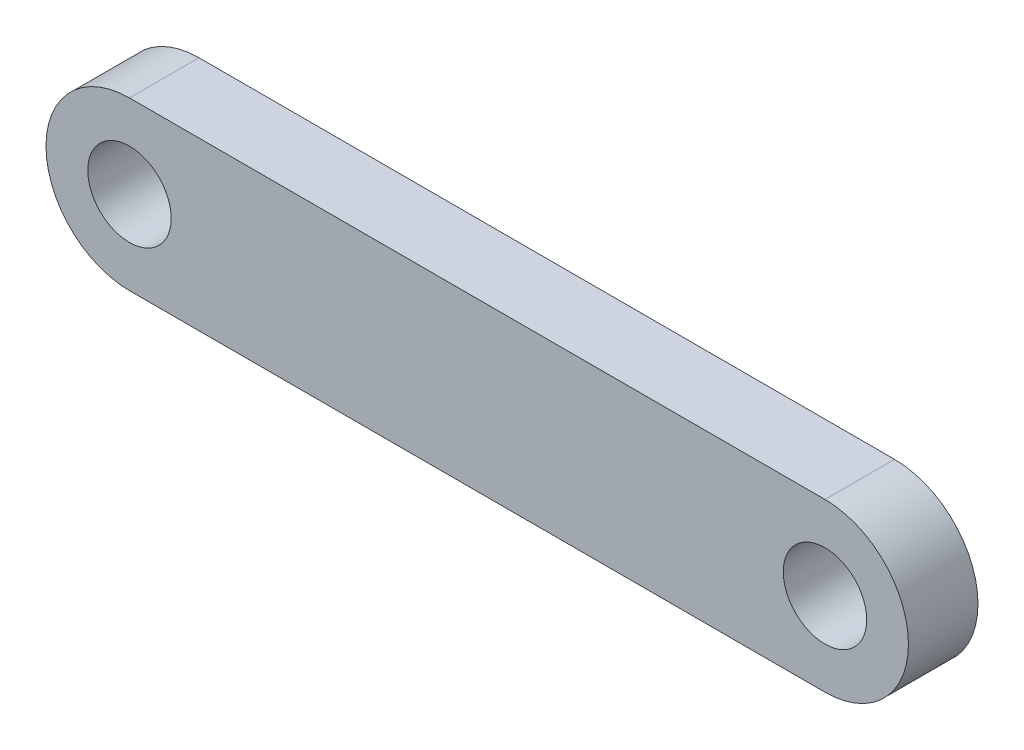
ISO-10303-21;
HEADER;
FILE_DESCRIPTION(('STEP AP214'),'2;1');
FILE_NAME('part.step','',(''),(''),'','','');
FILE_SCHEMA(('AUTOMOTIVE_DESIGN { 1 0 10303 214 1 1 1 1 }'));
ENDSEC;
DATA;
#1=APPLICATION_CONTEXT('core data for automotive mechanical design processes');
#2=APPLICATION_PROTOCOL_DEFINITION('international standard','automotive_design',2000,#1);
#3=PRODUCT_CONTEXT('',#1,'mechanical');
#4=PRODUCT('Part','Part','',(#3));
#5=PRODUCT_RELATED_PRODUCT_CATEGORY('part','',(#4));
#6=PRODUCT_DEFINITION_FORMATION('','',#4);
#7=PRODUCT_DEFINITION_CONTEXT('part definition',#1,'design');
#8=PRODUCT_DEFINITION('design','',#6,#7);
#9=PRODUCT_DEFINITION_SHAPE('','',#8);
#10=(LENGTH_UNIT() NAMED_UNIT(*) SI_UNIT(.MILLI.,.METRE.));
#11=(NAMED_UNIT(*) PLANE_ANGLE_UNIT() SI_UNIT($,.RADIAN.));
#12=(NAMED_UNIT(*) SI_UNIT($,.STERADIAN.) SOLID_ANGLE_UNIT());
#13=UNCERTAINTY_MEASURE_WITH_UNIT(LENGTH_MEASURE(1.E-05),#10,'distance_accuracy_value','');
#14=(GEOMETRIC_REPRESENTATION_CONTEXT(3) GLOBAL_UNCERTAINTY_ASSIGNED_CONTEXT((#13)) GLOBAL_UNIT_ASSIGNED_CONTEXT((#10,
#11,#12)) REPRESENTATION_CONTEXT('',''));
#15=CARTESIAN_POINT('',(0.,0.,0.));
#16=DIRECTION('',(0.,0.,1.));
#17=DIRECTION('',(1.,0.,0.));
#18=AXIS2_PLACEMENT_3D('',#15,#16,#17);
#19=CARTESIAN_POINT('',(-25.,0.,2.5));
#20=DIRECTION('',(0.,0.,1.));
#21=DIRECTION('',(1.,0.,0.));
#22=AXIS2_PLACEMENT_3D('',#19,#20,#21);
#23=PLANE('',#22);
#24=CARTESIAN_POINT('',(-25.,0.,2.5));
#25=DIRECTION('',(0.,0.,1.));
#26=DIRECTION('',(1.,0.,0.));
#27=AXIS2_PLACEMENT_3D('',#24,#25,#26);
#28=CIRCLE('',#27,3.);
#29=CARTESIAN_POINT('',(-22.,0.,2.5));
#30=VERTEX_POINT('',#29);
#31=EDGE_CURVE('E99',#30,#30,#28,.T.);
#32=ORIENTED_EDGE('',*,*,#31,.F.);
#33=EDGE_LOOP('',(#32));
#34=FACE_BOUND('',#33,.T.);
#35=CARTESIAN_POINT('',(-25.,0.,2.5));
#36=DIRECTION('',(0.,0.,1.));
#37=DIRECTION('',(1.,0.,0.));
#38=AXIS2_PLACEMENT_3D('',#35,#36,#37);
#39=CIRCLE('',#38,6.00000000000001);
#40=CARTESIAN_POINT('',(-25.,6.00000000000001,2.5));
#41=VERTEX_POINT('',#40);
#42=CARTESIAN_POINT('',(-25.,-6.00000000000001,2.5));
#43=VERTEX_POINT('',#42);
#44=EDGE_CURVE('E84',#41,#43,#39,.T.);
#45=ORIENTED_EDGE('',*,*,#44,.T.);
#46=DIRECTION('',(1.,0.,0.));
#47=VECTOR('',#46,1.);
#48=CARTESIAN_POINT('',(-25.,-6.00000000000001,2.5));
#49=LINE('',#48,#47);
#50=CARTESIAN_POINT('',(25.,-6.,2.5));
#51=VERTEX_POINT('',#50);
#52=EDGE_CURVE('E79',#43,#51,#49,.T.);
#53=ORIENTED_EDGE('',*,*,#52,.T.);
#54=CARTESIAN_POINT('',(25.,0.,2.5));
#55=DIRECTION('',(0.,0.,1.));
#56=DIRECTION('',(1.,0.,0.));
#57=AXIS2_PLACEMENT_3D('',#54,#55,#56);
#58=CIRCLE('',#57,6.00000000000001);
#59=CARTESIAN_POINT('',(25.,6.00000000000002,2.5));
#60=VERTEX_POINT('',#59);
#61=EDGE_CURVE('E82',#51,#60,#58,.T.);
#62=ORIENTED_EDGE('',*,*,#61,.T.);
#63=DIRECTION('',(-1.,0.,0.));
#64=VECTOR('',#63,1.);
#65=CARTESIAN_POINT('',(-25.,6.00000000000001,2.5));
#66=LINE('',#65,#64);
#67=EDGE_CURVE('E49',#60,#41,#66,.T.);
#68=ORIENTED_EDGE('',*,*,#67,.T.);
#69=EDGE_LOOP('',(#45,#53,#62,#68));
#70=FACE_BOUND('',#69,.T.);
#71=CARTESIAN_POINT('',(25.,0.,2.5));
#72=DIRECTION('',(0.,0.,1.));
#73=DIRECTION('',(1.,0.,0.));
#74=AXIS2_PLACEMENT_3D('',#71,#72,#73);
#75=CIRCLE('',#74,3.);
#76=CARTESIAN_POINT('',(28.,0.,2.5));
#77=VERTEX_POINT('',#76);
#78=EDGE_CURVE('E114',#77,#77,#75,.T.);
#79=ORIENTED_EDGE('',*,*,#78,.F.);
#80=EDGE_LOOP('',(#79));
#81=FACE_BOUND('',#80,.T.);
#82=ADVANCED_FACE('F32',(#34,#70,#81),#23,.T.);
#83=CARTESIAN_POINT('',(-25.,0.,-2.5));
#84=DIRECTION('',(0.,0.,1.));
#85=DIRECTION('',(1.,0.,0.));
#86=AXIS2_PLACEMENT_3D('',#83,#84,#85);
#87=PLANE('',#86);
#88=CARTESIAN_POINT('',(-25.,0.,-2.5));
#89=DIRECTION('',(0.,0.,1.));
#90=DIRECTION('',(1.,0.,0.));
#91=AXIS2_PLACEMENT_3D('',#88,#89,#90);
#92=CIRCLE('',#91,3.);
#93=CARTESIAN_POINT('',(-22.,0.,-2.5));
#94=VERTEX_POINT('',#93);
#95=EDGE_CURVE('E111',#94,#94,#92,.T.);
#96=ORIENTED_EDGE('',*,*,#95,.T.);
#97=EDGE_LOOP('',(#96));
#98=FACE_BOUND('',#97,.T.);
#99=CARTESIAN_POINT('',(-25.,0.,-2.5));
#100=DIRECTION('',(0.,0.,1.));
#101=DIRECTION('',(1.,0.,0.));
#102=AXIS2_PLACEMENT_3D('',#99,#100,#101);
#103=CIRCLE('',#102,6.00000000000001);
#104=CARTESIAN_POINT('',(-25.,6.00000000000001,-2.5));
#105=VERTEX_POINT('',#104);
#106=CARTESIAN_POINT('',(-25.,-6.00000000000001,-2.5));
#107=VERTEX_POINT('',#106);
#108=EDGE_CURVE('E96',#105,#107,#103,.T.);
#109=ORIENTED_EDGE('',*,*,#108,.F.);
#110=DIRECTION('',(-1.,0.,0.));
#111=VECTOR('',#110,1.);
#112=CARTESIAN_POINT('',(-25.,6.00000000000001,-2.5));
#113=LINE('',#112,#111);
#114=CARTESIAN_POINT('',(25.,6.00000000000002,-2.5));
#115=VERTEX_POINT('',#114);
#116=EDGE_CURVE('E72',#115,#105,#113,.T.);
#117=ORIENTED_EDGE('',*,*,#116,.F.);
#118=CARTESIAN_POINT('',(25.,0.,-2.5));
#119=DIRECTION('',(0.,0.,1.));
#120=DIRECTION('',(1.,0.,0.));
#121=AXIS2_PLACEMENT_3D('',#118,#119,#120);
#122=CIRCLE('',#121,6.00000000000001);
#123=CARTESIAN_POINT('',(25.,-6.,-2.5));
#124=VERTEX_POINT('',#123);
#125=EDGE_CURVE('E66',#124,#115,#122,.T.);
#126=ORIENTED_EDGE('',*,*,#125,.F.);
#127=DIRECTION('',(1.,0.,0.));
#128=VECTOR('',#127,1.);
#129=CARTESIAN_POINT('',(-25.,-6.00000000000001,-2.5));
#130=LINE('',#129,#128);
#131=EDGE_CURVE('E88',#107,#124,#130,.T.);
#132=ORIENTED_EDGE('',*,*,#131,.F.);
#133=EDGE_LOOP('',(#109,#117,#126,#132));
#134=FACE_BOUND('',#133,.T.);
#135=CARTESIAN_POINT('',(25.,0.,-2.5));
#136=DIRECTION('',(0.,0.,1.));
#137=DIRECTION('',(1.,0.,0.));
#138=AXIS2_PLACEMENT_3D('',#135,#136,#137);
#139=CIRCLE('',#138,3.);
#140=CARTESIAN_POINT('',(28.,0.,-2.5));
#141=VERTEX_POINT('',#140);
#142=EDGE_CURVE('E117',#141,#141,#139,.T.);
#143=ORIENTED_EDGE('',*,*,#142,.T.);
#144=EDGE_LOOP('',(#143));
#145=FACE_BOUND('',#144,.T.);
#146=ADVANCED_FACE('F107',(#98,#134,#145),#87,.F.);
#147=CARTESIAN_POINT('',(-25.,0.,2.5));
#148=DIRECTION('',(0.,0.,-1.));
#149=DIRECTION('',(-1.,0.,0.));
#150=AXIS2_PLACEMENT_3D('',#147,#148,#149);
#151=CYLINDRICAL_SURFACE('',#150,6.00000000000001);
#152=ORIENTED_EDGE('',*,*,#108,.T.);
#153=DIRECTION('',(0.,0.,-1.));
#154=VECTOR('',#153,1.);
#155=CARTESIAN_POINT('',(-25.,-6.00000000000001,2.5));
#156=LINE('',#155,#154);
#157=EDGE_CURVE('E11',#43,#107,#156,.T.);
#158=ORIENTED_EDGE('',*,*,#157,.F.);
#159=ORIENTED_EDGE('',*,*,#44,.F.);
#160=DIRECTION('',(0.,0.,-1.));
#161=VECTOR('',#160,1.);
#162=CARTESIAN_POINT('',(-25.,6.00000000000001,2.5));
#163=LINE('',#162,#161);
#164=EDGE_CURVE('E92',#41,#105,#163,.T.);
#165=ORIENTED_EDGE('',*,*,#164,.T.);
#166=EDGE_LOOP('',(#152,#158,#159,#165));
#167=FACE_BOUND('',#166,.T.);
#168=ADVANCED_FACE('F34',(#167),#151,.T.);
#169=CARTESIAN_POINT('',(-25.,-6.00000000000001,2.5));
#170=DIRECTION('',(0.,1.,0.));
#171=DIRECTION('',(-1.,0.,0.));
#172=AXIS2_PLACEMENT_3D('',#169,#170,#171);
#173=PLANE('',#172);
#174=ORIENTED_EDGE('',*,*,#131,.T.);
#175=DIRECTION('',(0.,0.,-1.));
#176=VECTOR('',#175,1.);
#177=CARTESIAN_POINT('',(25.,-6.,2.5));
#178=LINE('',#177,#176);
#179=EDGE_CURVE('E41',#51,#124,#178,.T.);
#180=ORIENTED_EDGE('',*,*,#179,.F.);
#181=ORIENTED_EDGE('',*,*,#52,.F.);
#182=ORIENTED_EDGE('',*,*,#157,.T.);
#183=EDGE_LOOP('',(#174,#180,#181,#182));
#184=FACE_BOUND('',#183,.T.);
#185=ADVANCED_FACE('F87',(#184),#173,.F.);
#186=CARTESIAN_POINT('',(25.,0.,2.5));
#187=DIRECTION('',(0.,0.,-1.));
#188=DIRECTION('',(-1.,0.,0.));
#189=AXIS2_PLACEMENT_3D('',#186,#187,#188);
#190=CYLINDRICAL_SURFACE('',#189,6.00000000000001);
#191=ORIENTED_EDGE('',*,*,#125,.T.);
#192=DIRECTION('',(0.,0.,-1.));
#193=VECTOR('',#192,1.);
#194=CARTESIAN_POINT('',(25.,6.00000000000002,2.5));
#195=LINE('',#194,#193);
#196=EDGE_CURVE('E89',#60,#115,#195,.T.);
#197=ORIENTED_EDGE('',*,*,#196,.F.);
#198=ORIENTED_EDGE('',*,*,#61,.F.);
#199=ORIENTED_EDGE('',*,*,#179,.T.);
#200=EDGE_LOOP('',(#191,#197,#198,#199));
#201=FACE_BOUND('',#200,.T.);
#202=ADVANCED_FACE('F90',(#201),#190,.T.);
#203=CARTESIAN_POINT('',(-25.,6.00000000000001,2.5));
#204=DIRECTION('',(0.,-1.,0.));
#205=DIRECTION('',(1.,0.,0.));
#206=AXIS2_PLACEMENT_3D('',#203,#204,#205);
#207=PLANE('',#206);
#208=ORIENTED_EDGE('',*,*,#116,.T.);
#209=ORIENTED_EDGE('',*,*,#164,.F.);
#210=ORIENTED_EDGE('',*,*,#67,.F.);
#211=ORIENTED_EDGE('',*,*,#196,.T.);
#212=EDGE_LOOP('',(#208,#209,#210,#211));
#213=FACE_BOUND('',#212,.T.);
#214=ADVANCED_FACE('F104',(#213),#207,.F.);
#215=CARTESIAN_POINT('',(-25.,0.,2.5));
#216=DIRECTION('',(0.,0.,-1.));
#217=DIRECTION('',(-1.,0.,0.));
#218=AXIS2_PLACEMENT_3D('',#215,#216,#217);
#219=CYLINDRICAL_SURFACE('',#218,3.);
#220=ORIENTED_EDGE('',*,*,#31,.T.);
#221=EDGE_LOOP('',(#220));
#222=FACE_BOUND('',#221,.T.);
#223=ORIENTED_EDGE('',*,*,#95,.F.);
#224=EDGE_LOOP('',(#223));
#225=FACE_BOUND('',#224,.T.);
#226=ADVANCED_FACE('F135',(#222,#225),#219,.F.);
#227=CARTESIAN_POINT('',(25.,0.,2.5));
#228=DIRECTION('',(0.,0.,-1.));
#229=DIRECTION('',(-1.,0.,0.));
#230=AXIS2_PLACEMENT_3D('',#227,#228,#229);
#231=CYLINDRICAL_SURFACE('',#230,3.);
#232=ORIENTED_EDGE('',*,*,#78,.T.);
#233=EDGE_LOOP('',(#232));
#234=FACE_BOUND('',#233,.T.);
#235=ORIENTED_EDGE('',*,*,#142,.F.);
#236=EDGE_LOOP('',(#235));
#237=FACE_BOUND('',#236,.T.);
#238=ADVANCED_FACE('F123',(#234,#237),#231,.F.);
#239=CLOSED_SHELL('',(#82,#146,#168,#185,#202,#214,#226,#238));
#240=MANIFOLD_SOLID_BREP('B2',#239);
#241=ADVANCED_BREP_SHAPE_REPRESENTATION('',(#18,#240),#14);
#242=SHAPE_DEFINITION_REPRESENTATION(#9,#241);
ENDSEC;
END-ISO-10303-21;
